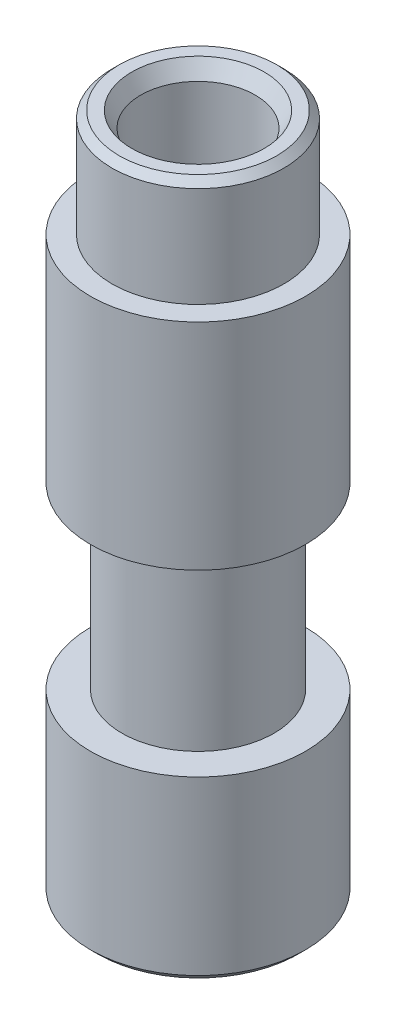
ISO-10303-21;
HEADER;
FILE_DESCRIPTION(('STEP AP214'),'2;1');
FILE_NAME('part.step','',(''),(''),'','','');
FILE_SCHEMA(('AUTOMOTIVE_DESIGN { 1 0 10303 214 1 1 1 1 }'));
ENDSEC;
DATA;
#1=APPLICATION_CONTEXT('core data for automotive mechanical design processes');
#2=APPLICATION_PROTOCOL_DEFINITION('international standard','automotive_design',2000,#1);
#3=PRODUCT_CONTEXT('',#1,'mechanical');
#4=PRODUCT('Part','Part','',(#3));
#5=PRODUCT_RELATED_PRODUCT_CATEGORY('part','',(#4));
#6=PRODUCT_DEFINITION_FORMATION('','',#4);
#7=PRODUCT_DEFINITION_CONTEXT('part definition',#1,'design');
#8=PRODUCT_DEFINITION('design','',#6,#7);
#9=PRODUCT_DEFINITION_SHAPE('','',#8);
#10=(LENGTH_UNIT() NAMED_UNIT(*) SI_UNIT(.MILLI.,.METRE.));
#11=(NAMED_UNIT(*) PLANE_ANGLE_UNIT() SI_UNIT($,.RADIAN.));
#12=(NAMED_UNIT(*) SI_UNIT($,.STERADIAN.) SOLID_ANGLE_UNIT());
#13=UNCERTAINTY_MEASURE_WITH_UNIT(LENGTH_MEASURE(1.E-05),#10,'distance_accuracy_value','');
#14=(GEOMETRIC_REPRESENTATION_CONTEXT(3) GLOBAL_UNCERTAINTY_ASSIGNED_CONTEXT((#13)) GLOBAL_UNIT_ASSIGNED_CONTEXT((#10,
#11,#12)) REPRESENTATION_CONTEXT('',''));
#15=CARTESIAN_POINT('',(0.,0.,0.));
#16=DIRECTION('',(0.,0.,1.));
#17=DIRECTION('',(1.,0.,0.));
#18=AXIS2_PLACEMENT_3D('',#15,#16,#17);
#19=CARTESIAN_POINT('',(-3.,0.,0.));
#20=DIRECTION('',(0.,1.,0.));
#21=DIRECTION('',(0.,0.,1.));
#22=AXIS2_PLACEMENT_3D('',#19,#20,#21);
#23=PLANE('',#22);
#24=CARTESIAN_POINT('',(0.,0.,0.));
#25=DIRECTION('',(0.,1.,0.));
#26=DIRECTION('',(0.,0.,1.));
#27=AXIS2_PLACEMENT_3D('',#24,#25,#26);
#28=CIRCLE('',#27,2.8);
#29=CARTESIAN_POINT('',(0.,0.,2.8));
#30=VERTEX_POINT('',#29);
#31=EDGE_CURVE('E69',#30,#30,#28,.F.);
#32=ORIENTED_EDGE('',*,*,#31,.T.);
#33=EDGE_LOOP('',(#32));
#34=FACE_BOUND('',#33,.T.);
#35=CARTESIAN_POINT('',(0.,0.,0.));
#36=DIRECTION('',(0.,-1.,0.));
#37=DIRECTION('',(0.,0.,-1.));
#38=AXIS2_PLACEMENT_3D('',#35,#36,#37);
#39=CIRCLE('',#38,1.6);
#40=CARTESIAN_POINT('',(0.,0.,-1.6));
#41=VERTEX_POINT('',#40);
#42=EDGE_CURVE('E72',#41,#41,#39,.T.);
#43=ORIENTED_EDGE('',*,*,#42,.F.);
#44=EDGE_LOOP('',(#43));
#45=FACE_BOUND('',#44,.T.);
#46=ADVANCED_FACE('F46',(#34,#45),#23,.F.);
#47=CARTESIAN_POINT('',(0.,0.,0.));
#48=DIRECTION('',(0.,-1.,0.));
#49=DIRECTION('',(0.,0.,-1.));
#50=AXIS2_PLACEMENT_3D('',#47,#48,#49);
#51=CYLINDRICAL_SURFACE('',#50,1.6);
#52=CARTESIAN_POINT('',(0.,18.5669872981078,0.));
#53=DIRECTION('',(0.,-1.,0.));
#54=DIRECTION('',(0.,0.,-1.));
#55=AXIS2_PLACEMENT_3D('',#52,#53,#54);
#56=CIRCLE('',#55,1.6);
#57=CARTESIAN_POINT('',(0.,18.5669872981078,-1.6));
#58=VERTEX_POINT('',#57);
#59=EDGE_CURVE('E12',#58,#58,#56,.F.);
#60=ORIENTED_EDGE('',*,*,#59,.T.);
#61=EDGE_LOOP('',(#60));
#62=FACE_BOUND('',#61,.T.);
#63=ORIENTED_EDGE('',*,*,#42,.T.);
#64=EDGE_LOOP('',(#63));
#65=FACE_BOUND('',#64,.T.);
#66=ADVANCED_FACE('F134',(#62,#65),#51,.F.);
#67=CARTESIAN_POINT('',(-1.6,19.,0.));
#68=DIRECTION('',(0.,-1.,0.));
#69=DIRECTION('',(0.,0.,-1.));
#70=AXIS2_PLACEMENT_3D('',#67,#68,#69);
#71=PLANE('',#70);
#72=CARTESIAN_POINT('',(0.,19.,0.));
#73=DIRECTION('',(0.,-1.,0.));
#74=DIRECTION('',(0.,0.,-1.));
#75=AXIS2_PLACEMENT_3D('',#72,#73,#74);
#76=CIRCLE('',#75,1.85000000000001);
#77=CARTESIAN_POINT('',(0.,19.,-1.85000000000001));
#78=VERTEX_POINT('',#77);
#79=EDGE_CURVE('E53',#78,#78,#76,.T.);
#80=ORIENTED_EDGE('',*,*,#79,.T.);
#81=EDGE_LOOP('',(#80));
#82=FACE_BOUND('',#81,.T.);
#83=CARTESIAN_POINT('',(0.,19.,0.));
#84=DIRECTION('',(0.,-1.,0.));
#85=DIRECTION('',(0.,0.,-1.));
#86=AXIS2_PLACEMENT_3D('',#83,#84,#85);
#87=CIRCLE('',#86,2.2);
#88=CARTESIAN_POINT('',(0.,19.,-2.2));
#89=VERTEX_POINT('',#88);
#90=EDGE_CURVE('E57',#89,#89,#87,.F.);
#91=ORIENTED_EDGE('',*,*,#90,.T.);
#92=EDGE_LOOP('',(#91));
#93=FACE_BOUND('',#92,.T.);
#94=ADVANCED_FACE('F128',(#82,#93),#71,.F.);
#95=CARTESIAN_POINT('',(0.,0.,0.));
#96=DIRECTION('',(0.,-1.,0.));
#97=DIRECTION('',(0.,0.,-1.));
#98=AXIS2_PLACEMENT_3D('',#95,#96,#97);
#99=CYLINDRICAL_SURFACE('',#98,2.4);
#100=CARTESIAN_POINT('',(0.,18.8,0.));
#101=DIRECTION('',(0.,-1.,0.));
#102=DIRECTION('',(0.,0.,-1.));
#103=AXIS2_PLACEMENT_3D('',#100,#101,#102);
#104=CIRCLE('',#103,2.4);
#105=CARTESIAN_POINT('',(0.,18.8,-2.4));
#106=VERTEX_POINT('',#105);
#107=EDGE_CURVE('E61',#106,#106,#104,.T.);
#108=ORIENTED_EDGE('',*,*,#107,.T.);
#109=EDGE_LOOP('',(#108));
#110=FACE_BOUND('',#109,.T.);
#111=CARTESIAN_POINT('',(0.,16.,0.));
#112=DIRECTION('',(0.,-1.,0.));
#113=DIRECTION('',(0.,0.,-1.));
#114=AXIS2_PLACEMENT_3D('',#111,#112,#113);
#115=CIRCLE('',#114,2.4);
#116=CARTESIAN_POINT('',(0.,16.,-2.4));
#117=VERTEX_POINT('',#116);
#118=EDGE_CURVE('E75',#117,#117,#115,.T.);
#119=ORIENTED_EDGE('',*,*,#118,.F.);
#120=EDGE_LOOP('',(#119));
#121=FACE_BOUND('',#120,.T.);
#122=ADVANCED_FACE('F123',(#110,#121),#99,.T.);
#123=CARTESIAN_POINT('',(-2.4,16.,0.));
#124=DIRECTION('',(0.,-1.,0.));
#125=DIRECTION('',(0.,0.,-1.));
#126=AXIS2_PLACEMENT_3D('',#123,#124,#125);
#127=PLANE('',#126);
#128=CARTESIAN_POINT('',(0.,16.,0.));
#129=DIRECTION('',(0.,-1.,0.));
#130=DIRECTION('',(0.,0.,-1.));
#131=AXIS2_PLACEMENT_3D('',#128,#129,#130);
#132=CIRCLE('',#131,3.);
#133=CARTESIAN_POINT('',(0.,16.,-3.));
#134=VERTEX_POINT('',#133);
#135=EDGE_CURVE('E78',#134,#134,#132,.T.);
#136=ORIENTED_EDGE('',*,*,#135,.F.);
#137=EDGE_LOOP('',(#136));
#138=FACE_BOUND('',#137,.T.);
#139=ORIENTED_EDGE('',*,*,#118,.T.);
#140=EDGE_LOOP('',(#139));
#141=FACE_BOUND('',#140,.T.);
#142=ADVANCED_FACE('F117',(#138,#141),#127,.F.);
#143=CARTESIAN_POINT('',(0.,0.,0.));
#144=DIRECTION('',(0.,-1.,0.));
#145=DIRECTION('',(0.,0.,-1.));
#146=AXIS2_PLACEMENT_3D('',#143,#144,#145);
#147=CYLINDRICAL_SURFACE('',#146,3.);
#148=CARTESIAN_POINT('',(0.,10.,0.));
#149=DIRECTION('',(0.,-1.,0.));
#150=DIRECTION('',(0.,0.,-1.));
#151=AXIS2_PLACEMENT_3D('',#148,#149,#150);
#152=CIRCLE('',#151,3.);
#153=CARTESIAN_POINT('',(0.,10.,-3.));
#154=VERTEX_POINT('',#153);
#155=EDGE_CURVE('E81',#154,#154,#152,.T.);
#156=ORIENTED_EDGE('',*,*,#155,.F.);
#157=EDGE_LOOP('',(#156));
#158=FACE_BOUND('',#157,.T.);
#159=ORIENTED_EDGE('',*,*,#135,.T.);
#160=EDGE_LOOP('',(#159));
#161=FACE_BOUND('',#160,.T.);
#162=ADVANCED_FACE('F111',(#158,#161),#147,.T.);
#163=CARTESIAN_POINT('',(-3.,10.,0.));
#164=DIRECTION('',(0.,1.,0.));
#165=DIRECTION('',(0.,0.,1.));
#166=AXIS2_PLACEMENT_3D('',#163,#164,#165);
#167=PLANE('',#166);
#168=CARTESIAN_POINT('',(0.,10.,0.));
#169=DIRECTION('',(0.,-1.,0.));
#170=DIRECTION('',(0.,0.,-1.));
#171=AXIS2_PLACEMENT_3D('',#168,#169,#170);
#172=CIRCLE('',#171,2.125);
#173=CARTESIAN_POINT('',(0.,10.,-2.125));
#174=VERTEX_POINT('',#173);
#175=EDGE_CURVE('E84',#174,#174,#172,.T.);
#176=ORIENTED_EDGE('',*,*,#175,.F.);
#177=EDGE_LOOP('',(#176));
#178=FACE_BOUND('',#177,.T.);
#179=ORIENTED_EDGE('',*,*,#155,.T.);
#180=EDGE_LOOP('',(#179));
#181=FACE_BOUND('',#180,.T.);
#182=ADVANCED_FACE('F105',(#178,#181),#167,.F.);
#183=CARTESIAN_POINT('',(0.,0.,0.));
#184=DIRECTION('',(0.,-1.,0.));
#185=DIRECTION('',(0.,0.,-1.));
#186=AXIS2_PLACEMENT_3D('',#183,#184,#185);
#187=CYLINDRICAL_SURFACE('',#186,2.125);
#188=CARTESIAN_POINT('',(0.,5.,0.));
#189=DIRECTION('',(0.,-1.,0.));
#190=DIRECTION('',(0.,0.,-1.));
#191=AXIS2_PLACEMENT_3D('',#188,#189,#190);
#192=CIRCLE('',#191,2.125);
#193=CARTESIAN_POINT('',(0.,5.,-2.125));
#194=VERTEX_POINT('',#193);
#195=EDGE_CURVE('E87',#194,#194,#192,.T.);
#196=ORIENTED_EDGE('',*,*,#195,.F.);
#197=EDGE_LOOP('',(#196));
#198=FACE_BOUND('',#197,.T.);
#199=ORIENTED_EDGE('',*,*,#175,.T.);
#200=EDGE_LOOP('',(#199));
#201=FACE_BOUND('',#200,.T.);
#202=ADVANCED_FACE('F99',(#198,#201),#187,.T.);
#203=CARTESIAN_POINT('',(-2.125,5.,0.));
#204=DIRECTION('',(0.,-1.,0.));
#205=DIRECTION('',(0.,0.,-1.));
#206=AXIS2_PLACEMENT_3D('',#203,#204,#205);
#207=PLANE('',#206);
#208=CARTESIAN_POINT('',(0.,5.,0.));
#209=DIRECTION('',(0.,-1.,0.));
#210=DIRECTION('',(0.,0.,-1.));
#211=AXIS2_PLACEMENT_3D('',#208,#209,#210);
#212=CIRCLE('',#211,3.);
#213=CARTESIAN_POINT('',(0.,5.,-3.));
#214=VERTEX_POINT('',#213);
#215=EDGE_CURVE('E90',#214,#214,#212,.T.);
#216=ORIENTED_EDGE('',*,*,#215,.F.);
#217=EDGE_LOOP('',(#216));
#218=FACE_BOUND('',#217,.T.);
#219=ORIENTED_EDGE('',*,*,#195,.T.);
#220=EDGE_LOOP('',(#219));
#221=FACE_BOUND('',#220,.T.);
#222=ADVANCED_FACE('F96',(#218,#221),#207,.F.);
#223=CARTESIAN_POINT('',(0.,0.,0.));
#224=DIRECTION('',(0.,-1.,0.));
#225=DIRECTION('',(0.,0.,-1.));
#226=AXIS2_PLACEMENT_3D('',#223,#224,#225);
#227=CYLINDRICAL_SURFACE('',#226,3.);
#228=CARTESIAN_POINT('',(0.,0.200000000000002,0.));
#229=DIRECTION('',(0.,1.,0.));
#230=DIRECTION('',(0.,0.,1.));
#231=AXIS2_PLACEMENT_3D('',#228,#229,#230);
#232=CIRCLE('',#231,3.);
#233=CARTESIAN_POINT('',(0.,0.200000000000002,3.));
#234=VERTEX_POINT('',#233);
#235=EDGE_CURVE('E66',#234,#234,#232,.T.);
#236=ORIENTED_EDGE('',*,*,#235,.T.);
#237=EDGE_LOOP('',(#236));
#238=FACE_BOUND('',#237,.T.);
#239=ORIENTED_EDGE('',*,*,#215,.T.);
#240=EDGE_LOOP('',(#239));
#241=FACE_BOUND('',#240,.T.);
#242=ADVANCED_FACE('F94',(#238,#241),#227,.T.);
#243=CARTESIAN_POINT('',(0.,0.,0.));
#244=DIRECTION('',(0.,1.,0.));
#245=DIRECTION('',(0.,0.,1.));
#246=AXIS2_PLACEMENT_3D('',#243,#244,#245);
#247=CONICAL_SURFACE('',#246,2.8,0.785398163397452);
#248=ORIENTED_EDGE('',*,*,#235,.F.);
#249=EDGE_LOOP('',(#248));
#250=FACE_BOUND('',#249,.T.);
#251=ORIENTED_EDGE('',*,*,#31,.F.);
#252=EDGE_LOOP('',(#251));
#253=FACE_BOUND('',#252,.T.);
#254=ADVANCED_FACE('F145',(#250,#253),#247,.T.);
#255=CARTESIAN_POINT('',(0.,18.8,0.));
#256=DIRECTION('',(0.,-1.,0.));
#257=DIRECTION('',(0.,0.,-1.));
#258=AXIS2_PLACEMENT_3D('',#255,#256,#257);
#259=CONICAL_SURFACE('',#258,2.4,0.785398163397447);
#260=ORIENTED_EDGE('',*,*,#90,.F.);
#261=EDGE_LOOP('',(#260));
#262=FACE_BOUND('',#261,.T.);
#263=ORIENTED_EDGE('',*,*,#107,.F.);
#264=EDGE_LOOP('',(#263));
#265=FACE_BOUND('',#264,.T.);
#266=ADVANCED_FACE('F147',(#262,#265),#259,.T.);
#267=CARTESIAN_POINT('',(0.,19.,0.));
#268=DIRECTION('',(0.,1.,0.));
#269=DIRECTION('',(0.,0.,1.));
#270=AXIS2_PLACEMENT_3D('',#267,#268,#269);
#271=CONICAL_SURFACE('',#270,1.85000000000001,0.523598775598297);
#272=ORIENTED_EDGE('',*,*,#59,.F.);
#273=EDGE_LOOP('',(#272));
#274=FACE_BOUND('',#273,.T.);
#275=ORIENTED_EDGE('',*,*,#79,.F.);
#276=EDGE_LOOP('',(#275));
#277=FACE_BOUND('',#276,.T.);
#278=ADVANCED_FACE('F48',(#274,#277),#271,.F.);
#279=CLOSED_SHELL('',(#46,#66,#94,#122,#142,#162,#182,#202,#222,#242,#254,#266,#278));
#280=MANIFOLD_SOLID_BREP('B2',#279);
#281=ADVANCED_BREP_SHAPE_REPRESENTATION('',(#18,#280),#14);
#282=SHAPE_DEFINITION_REPRESENTATION(#9,#281);
ENDSEC;
END-ISO-10303-21;
